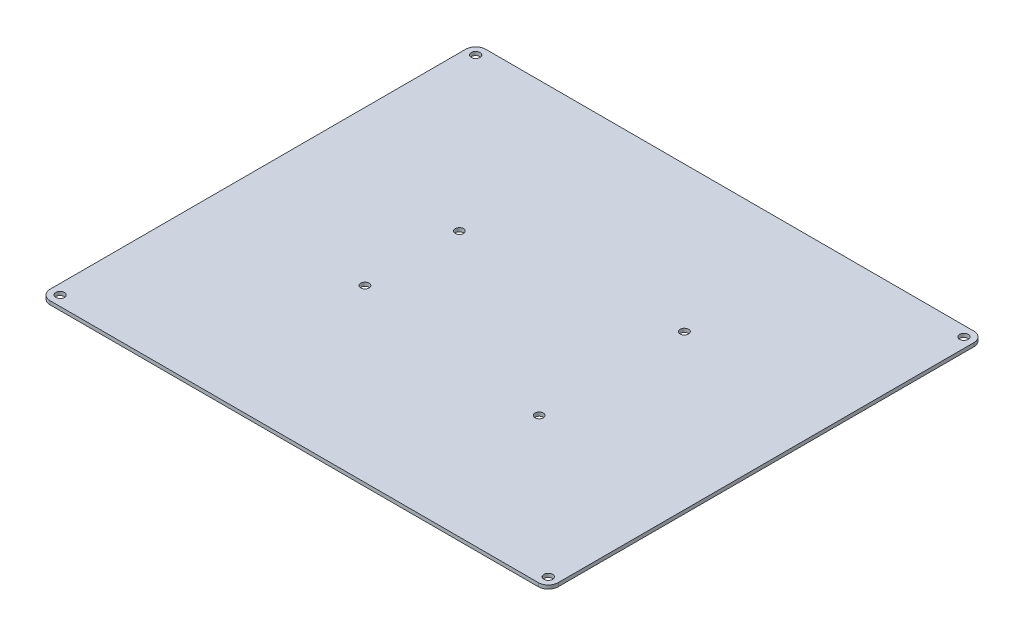
ISO-10303-21;
HEADER;
FILE_DESCRIPTION(('STEP AP214'),'2;1');
FILE_NAME('part.step','',(''),(''),'','','');
FILE_SCHEMA(('AUTOMOTIVE_DESIGN { 1 0 10303 214 1 1 1 1 }'));
ENDSEC;
DATA;
#1=APPLICATION_CONTEXT('core data for automotive mechanical design processes');
#2=APPLICATION_PROTOCOL_DEFINITION('international standard','automotive_design',2000,#1);
#3=PRODUCT_CONTEXT('',#1,'mechanical');
#4=PRODUCT('Part','Part','',(#3));
#5=PRODUCT_RELATED_PRODUCT_CATEGORY('part','',(#4));
#6=PRODUCT_DEFINITION_FORMATION('','',#4);
#7=PRODUCT_DEFINITION_CONTEXT('part definition',#1,'design');
#8=PRODUCT_DEFINITION('design','',#6,#7);
#9=PRODUCT_DEFINITION_SHAPE('','',#8);
#10=(LENGTH_UNIT() NAMED_UNIT(*) SI_UNIT(.MILLI.,.METRE.));
#11=(NAMED_UNIT(*) PLANE_ANGLE_UNIT() SI_UNIT($,.RADIAN.));
#12=(NAMED_UNIT(*) SI_UNIT($,.STERADIAN.) SOLID_ANGLE_UNIT());
#13=UNCERTAINTY_MEASURE_WITH_UNIT(LENGTH_MEASURE(1.E-05),#10,'distance_accuracy_value','');
#14=(GEOMETRIC_REPRESENTATION_CONTEXT(3) GLOBAL_UNCERTAINTY_ASSIGNED_CONTEXT((#13)) GLOBAL_UNIT_ASSIGNED_CONTEXT((#10,
#11,#12)) REPRESENTATION_CONTEXT('',''));
#15=CARTESIAN_POINT('',(0.,0.,0.));
#16=DIRECTION('',(0.,0.,1.));
#17=DIRECTION('',(1.,0.,0.));
#18=AXIS2_PLACEMENT_3D('',#15,#16,#17);
#19=CARTESIAN_POINT('',(0.,1.,0.));
#20=DIRECTION('',(0.,1.,0.));
#21=DIRECTION('',(0.,0.,1.));
#22=AXIS2_PLACEMENT_3D('',#19,#20,#21);
#23=PLANE('',#22);
#24=CARTESIAN_POINT('',(42.5,1.,73.));
#25=DIRECTION('',(0.,1.,0.));
#26=DIRECTION('',(0.,0.,1.));
#27=AXIS2_PLACEMENT_3D('',#24,#25,#26);
#28=CIRCLE('',#27,1.15);
#29=CARTESIAN_POINT('',(42.5,1.,74.15));
#30=VERTEX_POINT('',#29);
#31=EDGE_CURVE('E214',#30,#30,#28,.T.);
#32=ORIENTED_EDGE('',*,*,#31,.F.);
#33=EDGE_LOOP('',(#32));
#34=FACE_BOUND('',#33,.T.);
#35=CARTESIAN_POINT('',(42.5,1.,47.));
#36=DIRECTION('',(0.,1.,0.));
#37=DIRECTION('',(0.,0.,1.));
#38=AXIS2_PLACEMENT_3D('',#35,#36,#37);
#39=CIRCLE('',#38,1.15);
#40=CARTESIAN_POINT('',(42.5,1.,48.15));
#41=VERTEX_POINT('',#40);
#42=EDGE_CURVE('E202',#41,#41,#39,.T.);
#43=ORIENTED_EDGE('',*,*,#42,.F.);
#44=EDGE_LOOP('',(#43));
#45=FACE_BOUND('',#44,.T.);
#46=CARTESIAN_POINT('',(137.25,1.,117.25));
#47=DIRECTION('',(0.,1.,0.));
#48=DIRECTION('',(0.,0.,1.));
#49=AXIS2_PLACEMENT_3D('',#46,#47,#48);
#50=CIRCLE('',#49,1.20000000000001);
#51=CARTESIAN_POINT('',(137.25,1.,118.45));
#52=VERTEX_POINT('',#51);
#53=EDGE_CURVE('E190',#52,#52,#50,.T.);
#54=ORIENTED_EDGE('',*,*,#53,.F.);
#55=EDGE_LOOP('',(#54));
#56=FACE_BOUND('',#55,.T.);
#57=CARTESIAN_POINT('',(2.75,1.,2.75));
#58=DIRECTION('',(0.,1.,0.));
#59=DIRECTION('',(0.,0.,1.));
#60=AXIS2_PLACEMENT_3D('',#57,#58,#59);
#61=CIRCLE('',#60,1.2);
#62=CARTESIAN_POINT('',(2.75,1.,3.95));
#63=VERTEX_POINT('',#62);
#64=EDGE_CURVE('E131',#63,#63,#61,.T.);
#65=ORIENTED_EDGE('',*,*,#64,.F.);
#66=EDGE_LOOP('',(#65));
#67=FACE_BOUND('',#66,.T.);
#68=DIRECTION('',(-1.,0.,0.));
#69=VECTOR('',#68,1.);
#70=CARTESIAN_POINT('',(0.,1.,0.));
#71=LINE('',#70,#69);
#72=CARTESIAN_POINT('',(137.25,1.,0.));
#73=VERTEX_POINT('',#72);
#74=CARTESIAN_POINT('',(2.75,1.,0.));
#75=VERTEX_POINT('',#74);
#76=EDGE_CURVE('E140',#73,#75,#71,.T.);
#77=ORIENTED_EDGE('',*,*,#76,.T.);
#78=CARTESIAN_POINT('',(2.75,1.,2.75));
#79=DIRECTION('',(0.,1.,0.));
#80=DIRECTION('',(0.,0.,1.));
#81=AXIS2_PLACEMENT_3D('',#78,#79,#80);
#82=CIRCLE('',#81,2.75);
#83=CARTESIAN_POINT('',(0.,1.,2.75));
#84=VERTEX_POINT('',#83);
#85=EDGE_CURVE('E159',#75,#84,#82,.T.);
#86=ORIENTED_EDGE('',*,*,#85,.T.);
#87=DIRECTION('',(0.,0.,1.));
#88=VECTOR('',#87,1.);
#89=CARTESIAN_POINT('',(0.,1.,0.));
#90=LINE('',#89,#88);
#91=CARTESIAN_POINT('',(0.,1.,117.25));
#92=VERTEX_POINT('',#91);
#93=EDGE_CURVE('E123',#84,#92,#90,.T.);
#94=ORIENTED_EDGE('',*,*,#93,.T.);
#95=CARTESIAN_POINT('',(2.75000000000001,1.,117.25));
#96=DIRECTION('',(0.,1.,0.));
#97=DIRECTION('',(0.,0.,1.));
#98=AXIS2_PLACEMENT_3D('',#95,#96,#97);
#99=CIRCLE('',#98,2.75);
#100=CARTESIAN_POINT('',(2.75000000000001,1.,120.));
#101=VERTEX_POINT('',#100);
#102=EDGE_CURVE('E154',#92,#101,#99,.T.);
#103=ORIENTED_EDGE('',*,*,#102,.T.);
#104=DIRECTION('',(1.,0.,0.));
#105=VECTOR('',#104,1.);
#106=CARTESIAN_POINT('',(0.,1.,120.));
#107=LINE('',#106,#105);
#108=CARTESIAN_POINT('',(137.25,1.,120.));
#109=VERTEX_POINT('',#108);
#110=EDGE_CURVE('E170',#101,#109,#107,.T.);
#111=ORIENTED_EDGE('',*,*,#110,.T.);
#112=CARTESIAN_POINT('',(137.25,1.,117.25));
#113=DIRECTION('',(0.,1.,0.));
#114=DIRECTION('',(0.,0.,1.));
#115=AXIS2_PLACEMENT_3D('',#112,#113,#114);
#116=CIRCLE('',#115,2.75);
#117=CARTESIAN_POINT('',(140.,1.,117.25));
#118=VERTEX_POINT('',#117);
#119=EDGE_CURVE('E59',#109,#118,#116,.T.);
#120=ORIENTED_EDGE('',*,*,#119,.T.);
#121=DIRECTION('',(0.,0.,-1.));
#122=VECTOR('',#121,1.);
#123=CARTESIAN_POINT('',(140.,1.,0.));
#124=LINE('',#123,#122);
#125=CARTESIAN_POINT('',(140.,1.,2.75));
#126=VERTEX_POINT('',#125);
#127=EDGE_CURVE('E178',#118,#126,#124,.T.);
#128=ORIENTED_EDGE('',*,*,#127,.T.);
#129=CARTESIAN_POINT('',(137.25,1.,2.75));
#130=DIRECTION('',(0.,1.,0.));
#131=DIRECTION('',(0.,0.,1.));
#132=AXIS2_PLACEMENT_3D('',#129,#130,#131);
#133=CIRCLE('',#132,2.75);
#134=EDGE_CURVE('E157',#126,#73,#133,.T.);
#135=ORIENTED_EDGE('',*,*,#134,.T.);
#136=EDGE_LOOP('',(#77,#86,#94,#103,#111,#120,#128,#135));
#137=FACE_BOUND('',#136,.T.);
#138=CARTESIAN_POINT('',(137.25,1.,2.74999999999998));
#139=DIRECTION('',(0.,1.,0.));
#140=DIRECTION('',(0.,0.,-1.));
#141=AXIS2_PLACEMENT_3D('',#138,#139,#140);
#142=CIRCLE('',#141,1.20000000000001);
#143=CARTESIAN_POINT('',(137.25,1.,1.54999999999997));
#144=VERTEX_POINT('',#143);
#145=EDGE_CURVE('E185',#144,#144,#142,.T.);
#146=ORIENTED_EDGE('',*,*,#145,.F.);
#147=EDGE_LOOP('',(#146));
#148=FACE_BOUND('',#147,.T.);
#149=CARTESIAN_POINT('',(2.75,1.,117.25));
#150=DIRECTION('',(0.,1.,0.));
#151=DIRECTION('',(0.,0.,-1.));
#152=AXIS2_PLACEMENT_3D('',#149,#150,#151);
#153=CIRCLE('',#152,1.2);
#154=CARTESIAN_POINT('',(2.75,1.,116.05));
#155=VERTEX_POINT('',#154);
#156=EDGE_CURVE('E196',#155,#155,#153,.T.);
#157=ORIENTED_EDGE('',*,*,#156,.F.);
#158=EDGE_LOOP('',(#157));
#159=FACE_BOUND('',#158,.T.);
#160=CARTESIAN_POINT('',(97.5,1.,40.));
#161=DIRECTION('',(0.,1.,0.));
#162=DIRECTION('',(0.,0.,1.));
#163=AXIS2_PLACEMENT_3D('',#160,#161,#162);
#164=CIRCLE('',#163,1.15);
#165=CARTESIAN_POINT('',(97.5,1.,41.15));
#166=VERTEX_POINT('',#165);
#167=EDGE_CURVE('E208',#166,#166,#164,.T.);
#168=ORIENTED_EDGE('',*,*,#167,.F.);
#169=EDGE_LOOP('',(#168));
#170=FACE_BOUND('',#169,.T.);
#171=CARTESIAN_POINT('',(97.5,1.,80.));
#172=DIRECTION('',(0.,1.,0.));
#173=DIRECTION('',(0.,0.,1.));
#174=AXIS2_PLACEMENT_3D('',#171,#172,#173);
#175=CIRCLE('',#174,1.15);
#176=CARTESIAN_POINT('',(97.5,1.,81.15));
#177=VERTEX_POINT('',#176);
#178=EDGE_CURVE('E220',#177,#177,#175,.T.);
#179=ORIENTED_EDGE('',*,*,#178,.F.);
#180=EDGE_LOOP('',(#179));
#181=FACE_BOUND('',#180,.T.);
#182=ADVANCED_FACE('F37',(#34,#45,#56,#67,#137,#148,#159,#170,#181),#23,.T.);
#183=CARTESIAN_POINT('',(0.,0.,0.));
#184=DIRECTION('',(0.,1.,0.));
#185=DIRECTION('',(0.,0.,1.));
#186=AXIS2_PLACEMENT_3D('',#183,#184,#185);
#187=PLANE('',#186);
#188=DIRECTION('',(0.,0.,1.));
#189=VECTOR('',#188,1.);
#190=CARTESIAN_POINT('',(0.,0.,0.));
#191=LINE('',#190,#189);
#192=CARTESIAN_POINT('',(0.,0.,2.75));
#193=VERTEX_POINT('',#192);
#194=CARTESIAN_POINT('',(0.,0.,117.25));
#195=VERTEX_POINT('',#194);
#196=EDGE_CURVE('E120',#193,#195,#191,.T.);
#197=ORIENTED_EDGE('',*,*,#196,.F.);
#198=CARTESIAN_POINT('',(2.75,0.,2.75));
#199=DIRECTION('',(0.,1.,0.));
#200=DIRECTION('',(0.,0.,1.));
#201=AXIS2_PLACEMENT_3D('',#198,#199,#200);
#202=CIRCLE('',#201,2.75);
#203=CARTESIAN_POINT('',(2.75,0.,0.));
#204=VERTEX_POINT('',#203);
#205=EDGE_CURVE('E103',#193,#204,#202,.F.);
#206=ORIENTED_EDGE('',*,*,#205,.T.);
#207=DIRECTION('',(-1.,0.,0.));
#208=VECTOR('',#207,1.);
#209=CARTESIAN_POINT('',(0.,0.,0.));
#210=LINE('',#209,#208);
#211=CARTESIAN_POINT('',(137.25,0.,0.));
#212=VERTEX_POINT('',#211);
#213=EDGE_CURVE('E144',#212,#204,#210,.T.);
#214=ORIENTED_EDGE('',*,*,#213,.F.);
#215=CARTESIAN_POINT('',(137.25,0.,2.75));
#216=DIRECTION('',(0.,1.,0.));
#217=DIRECTION('',(0.,0.,1.));
#218=AXIS2_PLACEMENT_3D('',#215,#216,#217);
#219=CIRCLE('',#218,2.75);
#220=CARTESIAN_POINT('',(140.,0.,2.75));
#221=VERTEX_POINT('',#220);
#222=EDGE_CURVE('E114',#212,#221,#219,.F.);
#223=ORIENTED_EDGE('',*,*,#222,.T.);
#224=DIRECTION('',(0.,0.,-1.));
#225=VECTOR('',#224,1.);
#226=CARTESIAN_POINT('',(140.,0.,0.));
#227=LINE('',#226,#225);
#228=CARTESIAN_POINT('',(140.,0.,117.25));
#229=VERTEX_POINT('',#228);
#230=EDGE_CURVE('E134',#229,#221,#227,.T.);
#231=ORIENTED_EDGE('',*,*,#230,.F.);
#232=CARTESIAN_POINT('',(137.25,0.,117.25));
#233=DIRECTION('',(0.,1.,0.));
#234=DIRECTION('',(0.,0.,1.));
#235=AXIS2_PLACEMENT_3D('',#232,#233,#234);
#236=CIRCLE('',#235,2.75);
#237=CARTESIAN_POINT('',(137.25,0.,120.));
#238=VERTEX_POINT('',#237);
#239=EDGE_CURVE('E148',#229,#238,#236,.F.);
#240=ORIENTED_EDGE('',*,*,#239,.T.);
#241=DIRECTION('',(1.,0.,0.));
#242=VECTOR('',#241,1.);
#243=CARTESIAN_POINT('',(0.,0.,120.));
#244=LINE('',#243,#242);
#245=CARTESIAN_POINT('',(2.75000000000001,0.,120.));
#246=VERTEX_POINT('',#245);
#247=EDGE_CURVE('E130',#246,#238,#244,.T.);
#248=ORIENTED_EDGE('',*,*,#247,.F.);
#249=CARTESIAN_POINT('',(2.75000000000001,0.,117.25));
#250=DIRECTION('',(0.,1.,0.));
#251=DIRECTION('',(0.,0.,1.));
#252=AXIS2_PLACEMENT_3D('',#249,#250,#251);
#253=CIRCLE('',#252,2.75);
#254=EDGE_CURVE('E124',#246,#195,#253,.F.);
#255=ORIENTED_EDGE('',*,*,#254,.T.);
#256=EDGE_LOOP('',(#197,#206,#214,#223,#231,#240,#248,#255));
#257=FACE_BOUND('',#256,.T.);
#258=CARTESIAN_POINT('',(2.75,0.,2.75));
#259=DIRECTION('',(0.,1.,0.));
#260=DIRECTION('',(0.,0.,1.));
#261=AXIS2_PLACEMENT_3D('',#258,#259,#260);
#262=CIRCLE('',#261,1.2);
#263=CARTESIAN_POINT('',(2.75,0.,3.95));
#264=VERTEX_POINT('',#263);
#265=EDGE_CURVE('E137',#264,#264,#262,.T.);
#266=ORIENTED_EDGE('',*,*,#265,.T.);
#267=EDGE_LOOP('',(#266));
#268=FACE_BOUND('',#267,.T.);
#269=CARTESIAN_POINT('',(137.25,0.,2.74999999999998));
#270=DIRECTION('',(0.,1.,0.));
#271=DIRECTION('',(0.,0.,-1.));
#272=AXIS2_PLACEMENT_3D('',#269,#270,#271);
#273=CIRCLE('',#272,1.20000000000001);
#274=CARTESIAN_POINT('',(137.25,0.,1.54999999999997));
#275=VERTEX_POINT('',#274);
#276=EDGE_CURVE('E187',#275,#275,#273,.T.);
#277=ORIENTED_EDGE('',*,*,#276,.T.);
#278=EDGE_LOOP('',(#277));
#279=FACE_BOUND('',#278,.T.);
#280=CARTESIAN_POINT('',(137.25,0.,117.25));
#281=DIRECTION('',(0.,1.,0.));
#282=DIRECTION('',(0.,0.,1.));
#283=AXIS2_PLACEMENT_3D('',#280,#281,#282);
#284=CIRCLE('',#283,1.20000000000001);
#285=CARTESIAN_POINT('',(137.25,0.,118.45));
#286=VERTEX_POINT('',#285);
#287=EDGE_CURVE('E193',#286,#286,#284,.T.);
#288=ORIENTED_EDGE('',*,*,#287,.T.);
#289=EDGE_LOOP('',(#288));
#290=FACE_BOUND('',#289,.T.);
#291=CARTESIAN_POINT('',(2.75,0.,117.25));
#292=DIRECTION('',(0.,1.,0.));
#293=DIRECTION('',(0.,0.,-1.));
#294=AXIS2_PLACEMENT_3D('',#291,#292,#293);
#295=CIRCLE('',#294,1.2);
#296=CARTESIAN_POINT('',(2.75,0.,116.05));
#297=VERTEX_POINT('',#296);
#298=EDGE_CURVE('E199',#297,#297,#295,.T.);
#299=ORIENTED_EDGE('',*,*,#298,.T.);
#300=EDGE_LOOP('',(#299));
#301=FACE_BOUND('',#300,.T.);
#302=CARTESIAN_POINT('',(42.5,0.,47.));
#303=DIRECTION('',(0.,1.,0.));
#304=DIRECTION('',(0.,0.,1.));
#305=AXIS2_PLACEMENT_3D('',#302,#303,#304);
#306=CIRCLE('',#305,1.15);
#307=CARTESIAN_POINT('',(42.5,0.,48.15));
#308=VERTEX_POINT('',#307);
#309=EDGE_CURVE('E205',#308,#308,#306,.T.);
#310=ORIENTED_EDGE('',*,*,#309,.T.);
#311=EDGE_LOOP('',(#310));
#312=FACE_BOUND('',#311,.T.);
#313=CARTESIAN_POINT('',(97.5,0.,40.));
#314=DIRECTION('',(0.,1.,0.));
#315=DIRECTION('',(0.,0.,1.));
#316=AXIS2_PLACEMENT_3D('',#313,#314,#315);
#317=CIRCLE('',#316,1.15);
#318=CARTESIAN_POINT('',(97.5,0.,41.15));
#319=VERTEX_POINT('',#318);
#320=EDGE_CURVE('E211',#319,#319,#317,.T.);
#321=ORIENTED_EDGE('',*,*,#320,.T.);
#322=EDGE_LOOP('',(#321));
#323=FACE_BOUND('',#322,.T.);
#324=CARTESIAN_POINT('',(42.5,0.,73.));
#325=DIRECTION('',(0.,1.,0.));
#326=DIRECTION('',(0.,0.,1.));
#327=AXIS2_PLACEMENT_3D('',#324,#325,#326);
#328=CIRCLE('',#327,1.15);
#329=CARTESIAN_POINT('',(42.5,0.,74.15));
#330=VERTEX_POINT('',#329);
#331=EDGE_CURVE('E217',#330,#330,#328,.T.);
#332=ORIENTED_EDGE('',*,*,#331,.T.);
#333=EDGE_LOOP('',(#332));
#334=FACE_BOUND('',#333,.T.);
#335=CARTESIAN_POINT('',(97.5,0.,80.));
#336=DIRECTION('',(0.,1.,0.));
#337=DIRECTION('',(0.,0.,1.));
#338=AXIS2_PLACEMENT_3D('',#335,#336,#337);
#339=CIRCLE('',#338,1.15);
#340=CARTESIAN_POINT('',(97.5,0.,81.15));
#341=VERTEX_POINT('',#340);
#342=EDGE_CURVE('E223',#341,#341,#339,.T.);
#343=ORIENTED_EDGE('',*,*,#342,.T.);
#344=EDGE_LOOP('',(#343));
#345=FACE_BOUND('',#344,.T.);
#346=ADVANCED_FACE('F127',(#257,#268,#279,#290,#301,#312,#323,#334,#345),#187,.F.);
#347=CARTESIAN_POINT('',(0.,1.,0.));
#348=DIRECTION('',(1.,0.,0.));
#349=DIRECTION('',(0.,0.,-1.));
#350=AXIS2_PLACEMENT_3D('',#347,#348,#349);
#351=PLANE('',#350);
#352=ORIENTED_EDGE('',*,*,#93,.F.);
#353=DIRECTION('',(0.,-1.,0.));
#354=VECTOR('',#353,1.);
#355=CARTESIAN_POINT('',(0.,1.,2.75));
#356=LINE('',#355,#354);
#357=EDGE_CURVE('E107',#84,#193,#356,.T.);
#358=ORIENTED_EDGE('',*,*,#357,.T.);
#359=ORIENTED_EDGE('',*,*,#196,.T.);
#360=DIRECTION('',(0.,-1.,0.));
#361=VECTOR('',#360,1.);
#362=CARTESIAN_POINT('',(0.,1.,117.25));
#363=LINE('',#362,#361);
#364=EDGE_CURVE('E125',#195,#92,#363,.F.);
#365=ORIENTED_EDGE('',*,*,#364,.T.);
#366=EDGE_LOOP('',(#352,#358,#359,#365));
#367=FACE_BOUND('',#366,.T.);
#368=ADVANCED_FACE('F119',(#367),#351,.F.);
#369=CARTESIAN_POINT('',(0.,1.,120.));
#370=DIRECTION('',(0.,0.,-1.));
#371=DIRECTION('',(-1.,0.,0.));
#372=AXIS2_PLACEMENT_3D('',#369,#370,#371);
#373=PLANE('',#372);
#374=ORIENTED_EDGE('',*,*,#247,.T.);
#375=DIRECTION('',(0.,-1.,0.));
#376=VECTOR('',#375,1.);
#377=CARTESIAN_POINT('',(137.25,1.,120.));
#378=LINE('',#377,#376);
#379=EDGE_CURVE('E11',#238,#109,#378,.F.);
#380=ORIENTED_EDGE('',*,*,#379,.T.);
#381=ORIENTED_EDGE('',*,*,#110,.F.);
#382=DIRECTION('',(0.,-1.,0.));
#383=VECTOR('',#382,1.);
#384=CARTESIAN_POINT('',(2.75000000000001,1.,120.));
#385=LINE('',#384,#383);
#386=EDGE_CURVE('E45',#101,#246,#385,.T.);
#387=ORIENTED_EDGE('',*,*,#386,.T.);
#388=EDGE_LOOP('',(#374,#380,#381,#387));
#389=FACE_BOUND('',#388,.T.);
#390=ADVANCED_FACE('F168',(#389),#373,.F.);
#391=CARTESIAN_POINT('',(140.,1.,0.));
#392=DIRECTION('',(-1.,0.,0.));
#393=DIRECTION('',(0.,0.,1.));
#394=AXIS2_PLACEMENT_3D('',#391,#392,#393);
#395=PLANE('',#394);
#396=ORIENTED_EDGE('',*,*,#230,.T.);
#397=DIRECTION('',(0.,-1.,0.));
#398=VECTOR('',#397,1.);
#399=CARTESIAN_POINT('',(140.,1.,2.75));
#400=LINE('',#399,#398);
#401=EDGE_CURVE('E52',#221,#126,#400,.F.);
#402=ORIENTED_EDGE('',*,*,#401,.T.);
#403=ORIENTED_EDGE('',*,*,#127,.F.);
#404=DIRECTION('',(0.,-1.,0.));
#405=VECTOR('',#404,1.);
#406=CARTESIAN_POINT('',(140.,1.,117.25));
#407=LINE('',#406,#405);
#408=EDGE_CURVE('E161',#118,#229,#407,.T.);
#409=ORIENTED_EDGE('',*,*,#408,.T.);
#410=EDGE_LOOP('',(#396,#402,#403,#409));
#411=FACE_BOUND('',#410,.T.);
#412=ADVANCED_FACE('F177',(#411),#395,.F.);
#413=CARTESIAN_POINT('',(0.,1.,0.));
#414=DIRECTION('',(0.,0.,1.));
#415=DIRECTION('',(1.,0.,0.));
#416=AXIS2_PLACEMENT_3D('',#413,#414,#415);
#417=PLANE('',#416);
#418=ORIENTED_EDGE('',*,*,#213,.T.);
#419=DIRECTION('',(0.,-1.,0.));
#420=VECTOR('',#419,1.);
#421=CARTESIAN_POINT('',(2.75,1.,0.));
#422=LINE('',#421,#420);
#423=EDGE_CURVE('E108',#204,#75,#422,.F.);
#424=ORIENTED_EDGE('',*,*,#423,.T.);
#425=ORIENTED_EDGE('',*,*,#76,.F.);
#426=DIRECTION('',(0.,-1.,0.));
#427=VECTOR('',#426,1.);
#428=CARTESIAN_POINT('',(137.25,1.,0.));
#429=LINE('',#428,#427);
#430=EDGE_CURVE('E113',#73,#212,#429,.T.);
#431=ORIENTED_EDGE('',*,*,#430,.T.);
#432=EDGE_LOOP('',(#418,#424,#425,#431));
#433=FACE_BOUND('',#432,.T.);
#434=ADVANCED_FACE('F245',(#433),#417,.F.);
#435=CARTESIAN_POINT('',(2.75,1.,2.75));
#436=DIRECTION('',(0.,-1.,0.));
#437=DIRECTION('',(0.,0.,-1.));
#438=AXIS2_PLACEMENT_3D('',#435,#436,#437);
#439=CYLINDRICAL_SURFACE('',#438,1.2);
#440=ORIENTED_EDGE('',*,*,#64,.T.);
#441=EDGE_LOOP('',(#440));
#442=FACE_BOUND('',#441,.T.);
#443=ORIENTED_EDGE('',*,*,#265,.F.);
#444=EDGE_LOOP('',(#443));
#445=FACE_BOUND('',#444,.T.);
#446=ADVANCED_FACE('F242',(#442,#445),#439,.F.);
#447=CARTESIAN_POINT('',(137.25,1.,2.74999999999998));
#448=DIRECTION('',(0.,-1.,0.));
#449=DIRECTION('',(0.,0.,-1.));
#450=AXIS2_PLACEMENT_3D('',#447,#448,#449);
#451=CYLINDRICAL_SURFACE('',#450,1.20000000000001);
#452=ORIENTED_EDGE('',*,*,#145,.T.);
#453=EDGE_LOOP('',(#452));
#454=FACE_BOUND('',#453,.T.);
#455=ORIENTED_EDGE('',*,*,#276,.F.);
#456=EDGE_LOOP('',(#455));
#457=FACE_BOUND('',#456,.T.);
#458=ADVANCED_FACE('F304',(#454,#457),#451,.F.);
#459=CARTESIAN_POINT('',(137.25,1.,117.25));
#460=DIRECTION('',(0.,-1.,0.));
#461=DIRECTION('',(0.,0.,-1.));
#462=AXIS2_PLACEMENT_3D('',#459,#460,#461);
#463=CYLINDRICAL_SURFACE('',#462,1.20000000000001);
#464=ORIENTED_EDGE('',*,*,#53,.T.);
#465=EDGE_LOOP('',(#464));
#466=FACE_BOUND('',#465,.T.);
#467=ORIENTED_EDGE('',*,*,#287,.F.);
#468=EDGE_LOOP('',(#467));
#469=FACE_BOUND('',#468,.T.);
#470=ADVANCED_FACE('F301',(#466,#469),#463,.F.);
#471=CARTESIAN_POINT('',(2.75,1.,117.25));
#472=DIRECTION('',(0.,-1.,0.));
#473=DIRECTION('',(0.,0.,-1.));
#474=AXIS2_PLACEMENT_3D('',#471,#472,#473);
#475=CYLINDRICAL_SURFACE('',#474,1.2);
#476=ORIENTED_EDGE('',*,*,#156,.T.);
#477=EDGE_LOOP('',(#476));
#478=FACE_BOUND('',#477,.T.);
#479=ORIENTED_EDGE('',*,*,#298,.F.);
#480=EDGE_LOOP('',(#479));
#481=FACE_BOUND('',#480,.T.);
#482=ADVANCED_FACE('F297',(#478,#481),#475,.F.);
#483=CARTESIAN_POINT('',(42.5,1.,47.));
#484=DIRECTION('',(0.,-1.,0.));
#485=DIRECTION('',(0.,0.,-1.));
#486=AXIS2_PLACEMENT_3D('',#483,#484,#485);
#487=CYLINDRICAL_SURFACE('',#486,1.15);
#488=ORIENTED_EDGE('',*,*,#42,.T.);
#489=EDGE_LOOP('',(#488));
#490=FACE_BOUND('',#489,.T.);
#491=ORIENTED_EDGE('',*,*,#309,.F.);
#492=EDGE_LOOP('',(#491));
#493=FACE_BOUND('',#492,.T.);
#494=ADVANCED_FACE('F279',(#490,#493),#487,.F.);
#495=CARTESIAN_POINT('',(97.5,1.,40.));
#496=DIRECTION('',(0.,-1.,0.));
#497=DIRECTION('',(0.,0.,-1.));
#498=AXIS2_PLACEMENT_3D('',#495,#496,#497);
#499=CYLINDRICAL_SURFACE('',#498,1.15);
#500=ORIENTED_EDGE('',*,*,#167,.T.);
#501=EDGE_LOOP('',(#500));
#502=FACE_BOUND('',#501,.T.);
#503=ORIENTED_EDGE('',*,*,#320,.F.);
#504=EDGE_LOOP('',(#503));
#505=FACE_BOUND('',#504,.T.);
#506=ADVANCED_FACE('F275',(#502,#505),#499,.F.);
#507=CARTESIAN_POINT('',(42.5,1.,73.));
#508=DIRECTION('',(0.,-1.,0.));
#509=DIRECTION('',(0.,0.,-1.));
#510=AXIS2_PLACEMENT_3D('',#507,#508,#509);
#511=CYLINDRICAL_SURFACE('',#510,1.15);
#512=ORIENTED_EDGE('',*,*,#31,.T.);
#513=EDGE_LOOP('',(#512));
#514=FACE_BOUND('',#513,.T.);
#515=ORIENTED_EDGE('',*,*,#331,.F.);
#516=EDGE_LOOP('',(#515));
#517=FACE_BOUND('',#516,.T.);
#518=ADVANCED_FACE('F278',(#514,#517),#511,.F.);
#519=CARTESIAN_POINT('',(97.5,1.,80.));
#520=DIRECTION('',(0.,-1.,0.));
#521=DIRECTION('',(0.,0.,-1.));
#522=AXIS2_PLACEMENT_3D('',#519,#520,#521);
#523=CYLINDRICAL_SURFACE('',#522,1.15);
#524=ORIENTED_EDGE('',*,*,#178,.T.);
#525=EDGE_LOOP('',(#524));
#526=FACE_BOUND('',#525,.T.);
#527=ORIENTED_EDGE('',*,*,#342,.F.);
#528=EDGE_LOOP('',(#527));
#529=FACE_BOUND('',#528,.T.);
#530=ADVANCED_FACE('F229',(#526,#529),#523,.F.);
#531=CARTESIAN_POINT('',(2.75,1.,2.75));
#532=DIRECTION('',(0.,-1.,0.));
#533=DIRECTION('',(0.,0.,-1.));
#534=AXIS2_PLACEMENT_3D('',#531,#532,#533);
#535=CYLINDRICAL_SURFACE('',#534,2.75);
#536=ORIENTED_EDGE('',*,*,#85,.F.);
#537=ORIENTED_EDGE('',*,*,#423,.F.);
#538=ORIENTED_EDGE('',*,*,#205,.F.);
#539=ORIENTED_EDGE('',*,*,#357,.F.);
#540=EDGE_LOOP('',(#536,#537,#538,#539));
#541=FACE_BOUND('',#540,.T.);
#542=ADVANCED_FACE('F106',(#541),#535,.T.);
#543=CARTESIAN_POINT('',(137.25,1.,2.75));
#544=DIRECTION('',(0.,-1.,0.));
#545=DIRECTION('',(0.,0.,-1.));
#546=AXIS2_PLACEMENT_3D('',#543,#544,#545);
#547=CYLINDRICAL_SURFACE('',#546,2.75);
#548=ORIENTED_EDGE('',*,*,#134,.F.);
#549=ORIENTED_EDGE('',*,*,#401,.F.);
#550=ORIENTED_EDGE('',*,*,#222,.F.);
#551=ORIENTED_EDGE('',*,*,#430,.F.);
#552=EDGE_LOOP('',(#548,#549,#550,#551));
#553=FACE_BOUND('',#552,.T.);
#554=ADVANCED_FACE('F257',(#553),#547,.T.);
#555=CARTESIAN_POINT('',(137.25,1.,117.25));
#556=DIRECTION('',(0.,-1.,0.));
#557=DIRECTION('',(0.,0.,-1.));
#558=AXIS2_PLACEMENT_3D('',#555,#556,#557);
#559=CYLINDRICAL_SURFACE('',#558,2.75);
#560=ORIENTED_EDGE('',*,*,#119,.F.);
#561=ORIENTED_EDGE('',*,*,#379,.F.);
#562=ORIENTED_EDGE('',*,*,#239,.F.);
#563=ORIENTED_EDGE('',*,*,#408,.F.);
#564=EDGE_LOOP('',(#560,#561,#562,#563));
#565=FACE_BOUND('',#564,.T.);
#566=ADVANCED_FACE('F176',(#565),#559,.T.);
#567=CARTESIAN_POINT('',(2.75000000000001,1.,117.25));
#568=DIRECTION('',(0.,-1.,0.));
#569=DIRECTION('',(0.,0.,-1.));
#570=AXIS2_PLACEMENT_3D('',#567,#568,#569);
#571=CYLINDRICAL_SURFACE('',#570,2.75);
#572=ORIENTED_EDGE('',*,*,#102,.F.);
#573=ORIENTED_EDGE('',*,*,#364,.F.);
#574=ORIENTED_EDGE('',*,*,#254,.F.);
#575=ORIENTED_EDGE('',*,*,#386,.F.);
#576=EDGE_LOOP('',(#572,#573,#574,#575));
#577=FACE_BOUND('',#576,.T.);
#578=ADVANCED_FACE('F39',(#577),#571,.T.);
#579=CLOSED_SHELL('',(#182,#346,#368,#390,#412,#434,#446,#458,#470,#482,#494,#506,#518,#530,
#542,#554,#566,#578));
#580=MANIFOLD_SOLID_BREP('B2',#579);
#581=ADVANCED_BREP_SHAPE_REPRESENTATION('',(#18,#580),#14);
#582=SHAPE_DEFINITION_REPRESENTATION(#9,#581);
ENDSEC;
END-ISO-10303-21;
